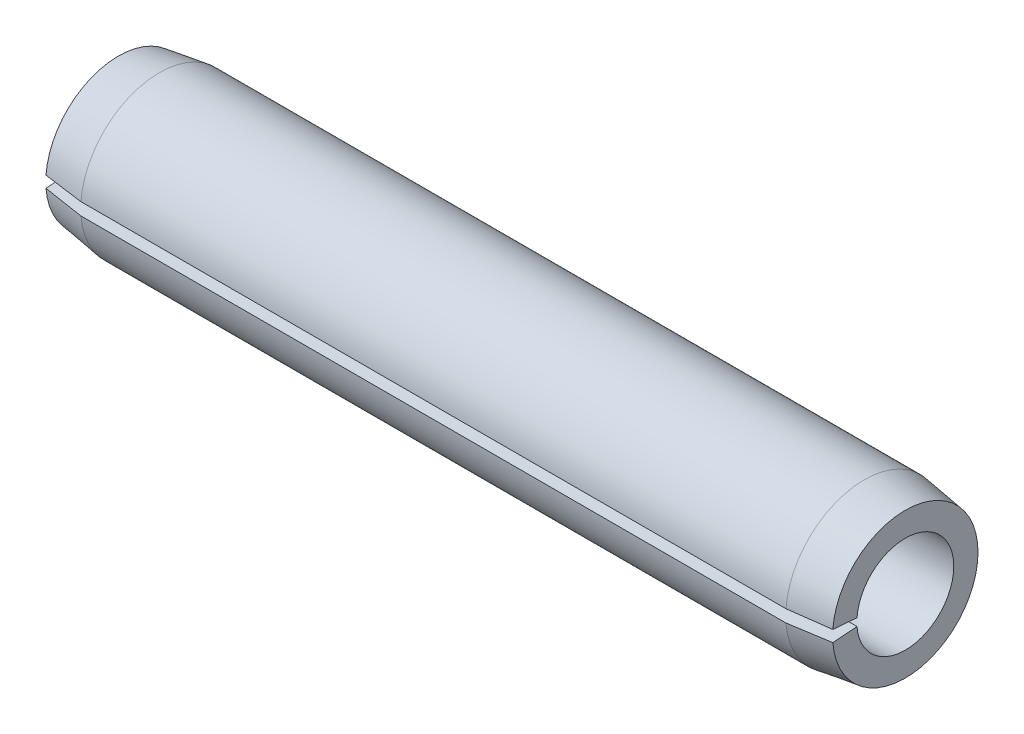
ISO-10303-21;
HEADER;
FILE_DESCRIPTION(('STEP AP214'),'2;1');
FILE_NAME('part.step','',(''),(''),'','','');
FILE_SCHEMA(('AUTOMOTIVE_DESIGN { 1 0 10303 214 1 1 1 1 }'));
ENDSEC;
DATA;
#1=APPLICATION_CONTEXT('core data for automotive mechanical design processes');
#2=APPLICATION_PROTOCOL_DEFINITION('international standard','automotive_design',2000,#1);
#3=PRODUCT_CONTEXT('',#1,'mechanical');
#4=PRODUCT('Part','Part','',(#3));
#5=PRODUCT_RELATED_PRODUCT_CATEGORY('part','',(#4));
#6=PRODUCT_DEFINITION_FORMATION('','',#4);
#7=PRODUCT_DEFINITION_CONTEXT('part definition',#1,'design');
#8=PRODUCT_DEFINITION('design','',#6,#7);
#9=PRODUCT_DEFINITION_SHAPE('','',#8);
#10=(LENGTH_UNIT() NAMED_UNIT(*) SI_UNIT(.MILLI.,.METRE.));
#11=(NAMED_UNIT(*) PLANE_ANGLE_UNIT() SI_UNIT($,.RADIAN.));
#12=(NAMED_UNIT(*) SI_UNIT($,.STERADIAN.) SOLID_ANGLE_UNIT());
#13=UNCERTAINTY_MEASURE_WITH_UNIT(LENGTH_MEASURE(1.E-05),#10,'distance_accuracy_value','');
#14=(GEOMETRIC_REPRESENTATION_CONTEXT(3) GLOBAL_UNCERTAINTY_ASSIGNED_CONTEXT((#13)) GLOBAL_UNIT_ASSIGNED_CONTEXT((#10,
#11,#12)) REPRESENTATION_CONTEXT('',''));
#15=CARTESIAN_POINT('',(0.,0.,0.));
#16=DIRECTION('',(0.,0.,1.));
#17=DIRECTION('',(1.,0.,0.));
#18=AXIS2_PLACEMENT_3D('',#15,#16,#17);
#19=CARTESIAN_POINT('',(0.,2.9337,0.));
#20=DIRECTION('',(1.,0.,0.));
#21=DIRECTION('',(0.,0.,-1.));
#22=AXIS2_PLACEMENT_3D('',#19,#20,#21);
#23=PLANE('',#22);
#24=DIRECTION('',(0.,0.0784590957278456,0.996917333733128));
#25=VECTOR('',#24,1.);
#26=CARTESIAN_POINT('',(0.,0.,0.));
#27=LINE('',#26,#25);
#28=CARTESIAN_POINT('',(0.,0.15345029942452,1.94977092131525));
#29=VERTEX_POINT('',#28);
#30=CARTESIAN_POINT('',(0.,0.230175449136781,2.92465638197288));
#31=VERTEX_POINT('',#30);
#32=EDGE_CURVE('E83',#29,#31,#27,.T.);
#33=ORIENTED_EDGE('',*,*,#32,.T.);
#34=CARTESIAN_POINT('',(0.,0.,0.));
#35=DIRECTION('',(-1.,0.,0.));
#36=DIRECTION('',(0.,0.,1.));
#37=AXIS2_PLACEMENT_3D('',#34,#35,#36);
#38=CIRCLE('',#37,2.9337);
#39=CARTESIAN_POINT('',(0.,-0.230175449136781,2.92465638197288));
#40=VERTEX_POINT('',#39);
#41=EDGE_CURVE('E102',#31,#40,#38,.T.);
#42=ORIENTED_EDGE('',*,*,#41,.T.);
#43=DIRECTION('',(0.,-0.0784590957278456,0.996917333733128));
#44=VECTOR('',#43,1.);
#45=CARTESIAN_POINT('',(0.,0.,0.));
#46=LINE('',#45,#44);
#47=CARTESIAN_POINT('',(0.,-0.15345029942452,1.94977092131525));
#48=VERTEX_POINT('',#47);
#49=EDGE_CURVE('E55',#48,#40,#46,.T.);
#50=ORIENTED_EDGE('',*,*,#49,.F.);
#51=CARTESIAN_POINT('',(0.,0.,0.));
#52=DIRECTION('',(-1.,0.,0.));
#53=DIRECTION('',(0.,0.,1.));
#54=AXIS2_PLACEMENT_3D('',#51,#52,#53);
#55=CIRCLE('',#54,1.9558);
#56=EDGE_CURVE('E98',#29,#48,#55,.T.);
#57=ORIENTED_EDGE('',*,*,#56,.F.);
#58=EDGE_LOOP('',(#33,#42,#50,#57));
#59=FACE_BOUND('',#58,.T.);
#60=ADVANCED_FACE('F34',(#59),#23,.F.);
#61=CARTESIAN_POINT('',(-9.52499999999999,0.,0.));
#62=DIRECTION('',(-1.,0.,0.));
#63=DIRECTION('',(0.,0.,1.));
#64=AXIS2_PLACEMENT_3D('',#61,#62,#63);
#65=CYLINDRICAL_SURFACE('',#64,1.9558);
#66=DIRECTION('',(-1.,0.,0.));
#67=VECTOR('',#66,1.);
#68=CARTESIAN_POINT('',(-9.52499999999999,0.15345029942452,1.94977092131525));
#69=LINE('',#68,#67);
#70=CARTESIAN_POINT('',(31.75,0.15345029942452,1.94977092131525));
#71=VERTEX_POINT('',#70);
#72=EDGE_CURVE('E86',#29,#71,#69,.F.);
#73=ORIENTED_EDGE('',*,*,#72,.F.);
#74=ORIENTED_EDGE('',*,*,#56,.T.);
#75=DIRECTION('',(-1.,0.,0.));
#76=VECTOR('',#75,1.);
#77=CARTESIAN_POINT('',(-9.52499999999999,-0.15345029942452,1.94977092131525));
#78=LINE('',#77,#76);
#79=CARTESIAN_POINT('',(31.75,-0.15345029942452,1.94977092131525));
#80=VERTEX_POINT('',#79);
#81=EDGE_CURVE('E122',#48,#80,#78,.F.);
#82=ORIENTED_EDGE('',*,*,#81,.T.);
#83=CARTESIAN_POINT('',(31.75,0.,0.));
#84=DIRECTION('',(-1.,0.,0.));
#85=DIRECTION('',(0.,0.,1.));
#86=AXIS2_PLACEMENT_3D('',#83,#84,#85);
#87=CIRCLE('',#86,1.9558);
#88=EDGE_CURVE('E100',#71,#80,#87,.T.);
#89=ORIENTED_EDGE('',*,*,#88,.F.);
#90=EDGE_LOOP('',(#73,#74,#82,#89));
#91=FACE_BOUND('',#90,.T.);
#92=ADVANCED_FACE('F96',(#91),#65,.F.);
#93=CARTESIAN_POINT('',(31.75,1.9558,0.));
#94=DIRECTION('',(-1.,0.,0.));
#95=DIRECTION('',(0.,0.,1.));
#96=AXIS2_PLACEMENT_3D('',#93,#94,#95);
#97=PLANE('',#96);
#98=DIRECTION('',(0.,0.0784590957278456,0.996917333733128));
#99=VECTOR('',#98,1.);
#100=CARTESIAN_POINT('',(31.75,0.,0.));
#101=LINE('',#100,#99);
#102=CARTESIAN_POINT('',(31.75,0.230175449136781,2.92465638197288));
#103=VERTEX_POINT('',#102);
#104=EDGE_CURVE('E133',#71,#103,#101,.T.);
#105=ORIENTED_EDGE('',*,*,#104,.F.);
#106=ORIENTED_EDGE('',*,*,#88,.T.);
#107=DIRECTION('',(0.,-0.0784590957278456,0.996917333733128));
#108=VECTOR('',#107,1.);
#109=CARTESIAN_POINT('',(31.75,0.,0.));
#110=LINE('',#109,#108);
#111=CARTESIAN_POINT('',(31.75,-0.230175449136781,2.92465638197288));
#112=VERTEX_POINT('',#111);
#113=EDGE_CURVE('E132',#80,#112,#110,.T.);
#114=ORIENTED_EDGE('',*,*,#113,.T.);
#115=CARTESIAN_POINT('',(31.75,0.,0.));
#116=DIRECTION('',(-1.,0.,0.));
#117=DIRECTION('',(0.,0.,1.));
#118=AXIS2_PLACEMENT_3D('',#115,#116,#117);
#119=CIRCLE('',#118,2.9337);
#120=EDGE_CURVE('E106',#103,#112,#119,.T.);
#121=ORIENTED_EDGE('',*,*,#120,.F.);
#122=EDGE_LOOP('',(#105,#106,#114,#121));
#123=FACE_BOUND('',#122,.T.);
#124=ADVANCED_FACE('F143',(#123),#97,.F.);
#125=CARTESIAN_POINT('',(31.75,0.,0.));
#126=DIRECTION('',(-1.,0.,0.));
#127=DIRECTION('',(0.,0.,1.));
#128=AXIS2_PLACEMENT_3D('',#125,#126,#127);
#129=CONICAL_SURFACE('',#128,2.9337,0.145126322173406);
#130=DIRECTION('',(-0.989487645379765,0.0113465523993622,0.144171617836029));
#131=VECTOR('',#130,1.);
#132=CARTESIAN_POINT('',(51.822684210526,0.,0.));
#133=LINE('',#132,#131);
#134=CARTESIAN_POINT('',(30.099,0.24910762893591,3.16521253460268));
#135=VERTEX_POINT('',#134);
#136=EDGE_CURVE('E103',#103,#135,#133,.T.);
#137=ORIENTED_EDGE('',*,*,#136,.F.);
#138=ORIENTED_EDGE('',*,*,#120,.T.);
#139=DIRECTION('',(-0.989487645379765,-0.0113465523993622,0.144171617836029));
#140=VECTOR('',#139,1.);
#141=CARTESIAN_POINT('',(51.822684210526,0.,0.));
#142=LINE('',#141,#140);
#143=CARTESIAN_POINT('',(30.099,-0.24910762893591,3.16521253460268));
#144=VERTEX_POINT('',#143);
#145=EDGE_CURVE('E125',#112,#144,#142,.T.);
#146=ORIENTED_EDGE('',*,*,#145,.T.);
#147=CARTESIAN_POINT('',(30.099,0.,0.));
#148=DIRECTION('',(-1.,0.,0.));
#149=DIRECTION('',(0.,0.,1.));
#150=AXIS2_PLACEMENT_3D('',#147,#148,#149);
#151=CIRCLE('',#150,3.175);
#152=EDGE_CURVE('E111',#135,#144,#151,.T.);
#153=ORIENTED_EDGE('',*,*,#152,.F.);
#154=EDGE_LOOP('',(#137,#138,#146,#153));
#155=FACE_BOUND('',#154,.T.);
#156=ADVANCED_FACE('F142',(#155),#129,.T.);
#157=CARTESIAN_POINT('',(-9.52499999999999,0.,0.));
#158=DIRECTION('',(-1.,0.,0.));
#159=DIRECTION('',(0.,0.,1.));
#160=AXIS2_PLACEMENT_3D('',#157,#158,#159);
#161=CYLINDRICAL_SURFACE('',#160,3.175);
#162=DIRECTION('',(-1.,0.,0.));
#163=VECTOR('',#162,1.);
#164=CARTESIAN_POINT('',(-9.52499999999999,0.24910762893591,3.16521253460268));
#165=LINE('',#164,#163);
#166=CARTESIAN_POINT('',(1.651,0.24910762893591,3.16521253460268));
#167=VERTEX_POINT('',#166);
#168=EDGE_CURVE('E47',#135,#167,#165,.T.);
#169=ORIENTED_EDGE('',*,*,#168,.F.);
#170=ORIENTED_EDGE('',*,*,#152,.T.);
#171=DIRECTION('',(-1.,0.,0.));
#172=VECTOR('',#171,1.);
#173=CARTESIAN_POINT('',(-9.52499999999999,-0.24910762893591,3.16521253460268));
#174=LINE('',#173,#172);
#175=CARTESIAN_POINT('',(1.651,-0.24910762893591,3.16521253460268));
#176=VERTEX_POINT('',#175);
#177=EDGE_CURVE('E128',#144,#176,#174,.T.);
#178=ORIENTED_EDGE('',*,*,#177,.T.);
#179=CARTESIAN_POINT('',(1.651,0.,0.));
#180=DIRECTION('',(-1.,0.,0.));
#181=DIRECTION('',(0.,0.,1.));
#182=AXIS2_PLACEMENT_3D('',#179,#180,#181);
#183=CIRCLE('',#182,3.175);
#184=EDGE_CURVE('E114',#167,#176,#183,.T.);
#185=ORIENTED_EDGE('',*,*,#184,.F.);
#186=EDGE_LOOP('',(#169,#170,#178,#185));
#187=FACE_BOUND('',#186,.T.);
#188=ADVANCED_FACE('F146',(#187),#161,.T.);
#189=CARTESIAN_POINT('',(1.651,0.,0.));
#190=DIRECTION('',(1.,0.,0.));
#191=DIRECTION('',(0.,0.,-1.));
#192=AXIS2_PLACEMENT_3D('',#189,#190,#191);
#193=CONICAL_SURFACE('',#192,3.175,0.145126322173404);
#194=DIRECTION('',(-0.989487645379765,-0.011346552399362,-0.144171617836027));
#195=VECTOR('',#194,1.);
#196=CARTESIAN_POINT('',(-20.0726842105263,0.,0.));
#197=LINE('',#196,#195);
#198=EDGE_CURVE('E11',#167,#31,#197,.T.);
#199=ORIENTED_EDGE('',*,*,#198,.F.);
#200=ORIENTED_EDGE('',*,*,#184,.T.);
#201=DIRECTION('',(-0.989487645379765,0.011346552399362,-0.144171617836027));
#202=VECTOR('',#201,1.);
#203=CARTESIAN_POINT('',(-20.0726842105263,0.,0.));
#204=LINE('',#203,#202);
#205=EDGE_CURVE('E41',#176,#40,#204,.T.);
#206=ORIENTED_EDGE('',*,*,#205,.T.);
#207=ORIENTED_EDGE('',*,*,#41,.F.);
#208=EDGE_LOOP('',(#199,#200,#206,#207));
#209=FACE_BOUND('',#208,.T.);
#210=ADVANCED_FACE('F149',(#209),#193,.T.);
#211=CARTESIAN_POINT('',(31.75,0.,0.));
#212=DIRECTION('',(0.,-0.996917333733128,-0.0784590957278456));
#213=DIRECTION('',(0.,0.0784590957278456,-0.996917333733128));
#214=AXIS2_PLACEMENT_3D('',#211,#212,#213);
#215=PLANE('',#214);
#216=ORIENTED_EDGE('',*,*,#49,.T.);
#217=ORIENTED_EDGE('',*,*,#205,.F.);
#218=ORIENTED_EDGE('',*,*,#177,.F.);
#219=ORIENTED_EDGE('',*,*,#145,.F.);
#220=ORIENTED_EDGE('',*,*,#113,.F.);
#221=ORIENTED_EDGE('',*,*,#81,.F.);
#222=EDGE_LOOP('',(#216,#217,#218,#219,#220,#221));
#223=FACE_BOUND('',#222,.T.);
#224=ADVANCED_FACE('F144',(#223),#215,.F.);
#225=CARTESIAN_POINT('',(31.75,0.,0.));
#226=DIRECTION('',(0.,-0.996917333733128,0.0784590957278456));
#227=DIRECTION('',(0.,-0.0784590957278456,-0.996917333733128));
#228=AXIS2_PLACEMENT_3D('',#225,#226,#227);
#229=PLANE('',#228);
#230=ORIENTED_EDGE('',*,*,#72,.T.);
#231=ORIENTED_EDGE('',*,*,#104,.T.);
#232=ORIENTED_EDGE('',*,*,#136,.T.);
#233=ORIENTED_EDGE('',*,*,#168,.T.);
#234=ORIENTED_EDGE('',*,*,#198,.T.);
#235=ORIENTED_EDGE('',*,*,#32,.F.);
#236=EDGE_LOOP('',(#230,#231,#232,#233,#234,#235));
#237=FACE_BOUND('',#236,.T.);
#238=ADVANCED_FACE('F85',(#237),#229,.T.);
#239=CLOSED_SHELL('',(#60,#92,#124,#156,#188,#210,#224,#238));
#240=MANIFOLD_SOLID_BREP('B2',#239);
#241=ADVANCED_BREP_SHAPE_REPRESENTATION('',(#18,#240),#14);
#242=SHAPE_DEFINITION_REPRESENTATION(#9,#241);
ENDSEC;
END-ISO-10303-21;
